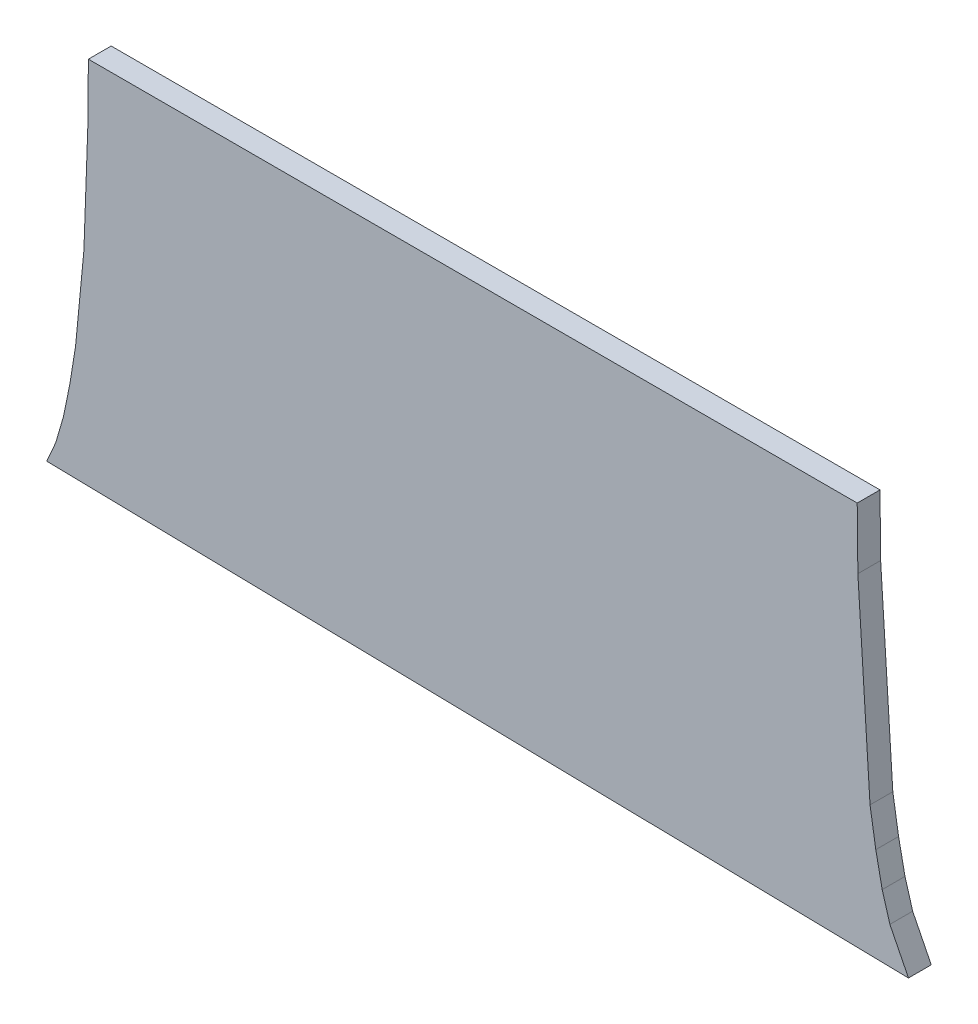
ISO-10303-21;
HEADER;
FILE_DESCRIPTION(('STEP AP214'),'2;1');
FILE_NAME('part.step','',(''),(''),'','','');
FILE_SCHEMA(('AUTOMOTIVE_DESIGN { 1 0 10303 214 1 1 1 1 }'));
ENDSEC;
DATA;
#1=APPLICATION_CONTEXT('core data for automotive mechanical design processes');
#2=APPLICATION_PROTOCOL_DEFINITION('international standard','automotive_design',2000,#1);
#3=PRODUCT_CONTEXT('',#1,'mechanical');
#4=PRODUCT('Part','Part','',(#3));
#5=PRODUCT_RELATED_PRODUCT_CATEGORY('part','',(#4));
#6=PRODUCT_DEFINITION_FORMATION('','',#4);
#7=PRODUCT_DEFINITION_CONTEXT('part definition',#1,'design');
#8=PRODUCT_DEFINITION('design','',#6,#7);
#9=PRODUCT_DEFINITION_SHAPE('','',#8);
#10=(LENGTH_UNIT() NAMED_UNIT(*) SI_UNIT(.MILLI.,.METRE.));
#11=(NAMED_UNIT(*) PLANE_ANGLE_UNIT() SI_UNIT($,.RADIAN.));
#12=(NAMED_UNIT(*) SI_UNIT($,.STERADIAN.) SOLID_ANGLE_UNIT());
#13=UNCERTAINTY_MEASURE_WITH_UNIT(LENGTH_MEASURE(1.E-05),#10,'distance_accuracy_value','');
#14=(GEOMETRIC_REPRESENTATION_CONTEXT(3) GLOBAL_UNCERTAINTY_ASSIGNED_CONTEXT((#13)) GLOBAL_UNIT_ASSIGNED_CONTEXT((#10,
#11,#12)) REPRESENTATION_CONTEXT('',''));
#15=CARTESIAN_POINT('',(0.,0.,0.));
#16=DIRECTION('',(0.,0.,1.));
#17=DIRECTION('',(1.,0.,0.));
#18=AXIS2_PLACEMENT_3D('',#15,#16,#17);
#19=CARTESIAN_POINT('',(54.2799987792969,76.4120025634766,0.));
#20=DIRECTION('',(0.999944665202742,-0.010519816185477,0.));
#21=DIRECTION('',(-0.010519816185477,-0.999944665202742,0.));
#22=AXIS2_PLACEMENT_3D('',#19,#20,#21);
#23=PLANE('',#22);
#24=DIRECTION('',(-0.010519816185477,-0.999944665202742,0.));
#25=VECTOR('',#24,1.);
#26=CARTESIAN_POINT('',(54.2799987792969,76.4120025634766,0.03556));
#27=LINE('',#26,#25);
#28=CARTESIAN_POINT('',(54.2799987792969,76.4120025634766,0.03556));
#29=VERTEX_POINT('',#28);
#30=CARTESIAN_POINT('',(54.2789993286133,76.3170013427734,0.03556));
#31=VERTEX_POINT('',#30);
#32=EDGE_CURVE('E11',#29,#31,#27,.T.);
#33=ORIENTED_EDGE('',*,*,#32,.F.);
#34=DIRECTION('',(0.,0.,1.));
#35=VECTOR('',#34,1.);
#36=CARTESIAN_POINT('',(54.2799987792969,76.4120025634766,0.));
#37=LINE('',#36,#35);
#38=CARTESIAN_POINT('',(54.2799987792969,76.4120025634766,0.));
#39=VERTEX_POINT('',#38);
#40=EDGE_CURVE('E24',#39,#29,#37,.T.);
#41=ORIENTED_EDGE('',*,*,#40,.F.);
#42=DIRECTION('',(-0.010519816185477,-0.999944665202742,0.));
#43=VECTOR('',#42,1.);
#44=CARTESIAN_POINT('',(54.2799987792969,76.4120025634766,0.));
#45=LINE('',#44,#43);
#46=CARTESIAN_POINT('',(54.2789993286133,76.3170013427734,0.));
#47=VERTEX_POINT('',#46);
#48=EDGE_CURVE('E142',#39,#47,#45,.T.);
#49=ORIENTED_EDGE('',*,*,#48,.T.);
#50=DIRECTION('',(0.,0.,1.));
#51=VECTOR('',#50,1.);
#52=CARTESIAN_POINT('',(54.2789993286133,76.3170013427734,0.));
#53=LINE('',#52,#51);
#54=EDGE_CURVE('E37',#47,#31,#53,.T.);
#55=ORIENTED_EDGE('',*,*,#54,.T.);
#56=EDGE_LOOP('',(#33,#41,#49,#55));
#57=FACE_BOUND('',#56,.T.);
#58=ADVANCED_FACE('F17',(#57),#23,.F.);
#59=CARTESIAN_POINT('',(54.2789993286133,76.3170013427734,0.));
#60=DIRECTION('',(0.999355095600041,-0.0359081174420683,0.));
#61=DIRECTION('',(-0.0359081174420683,-0.999355095600041,0.));
#62=AXIS2_PLACEMENT_3D('',#59,#60,#61);
#63=PLANE('',#62);
#64=DIRECTION('',(-0.0359081174420683,-0.999355095600041,0.));
#65=VECTOR('',#64,1.);
#66=CARTESIAN_POINT('',(54.2789993286133,76.3170013427734,0.03556));
#67=LINE('',#66,#65);
#68=CARTESIAN_POINT('',(54.2729988098144,76.1500015258789,0.03556));
#69=VERTEX_POINT('',#68);
#70=EDGE_CURVE('E238',#31,#69,#67,.T.);
#71=ORIENTED_EDGE('',*,*,#70,.F.);
#72=ORIENTED_EDGE('',*,*,#54,.F.);
#73=DIRECTION('',(-0.0359081174420683,-0.999355095600041,0.));
#74=VECTOR('',#73,1.);
#75=CARTESIAN_POINT('',(54.2789993286133,76.3170013427734,0.));
#76=LINE('',#75,#74);
#77=CARTESIAN_POINT('',(54.2729988098144,76.1500015258789,0.));
#78=VERTEX_POINT('',#77);
#79=EDGE_CURVE('E235',#47,#78,#76,.T.);
#80=ORIENTED_EDGE('',*,*,#79,.T.);
#81=DIRECTION('',(0.,0.,1.));
#82=VECTOR('',#81,1.);
#83=CARTESIAN_POINT('',(54.2729988098144,76.1500015258789,0.));
#84=LINE('',#83,#82);
#85=EDGE_CURVE('E233',#78,#69,#84,.T.);
#86=ORIENTED_EDGE('',*,*,#85,.T.);
#87=EDGE_LOOP('',(#71,#72,#80,#86));
#88=FACE_BOUND('',#87,.T.);
#89=ADVANCED_FACE('F246',(#88),#63,.F.);
#90=CARTESIAN_POINT('',(54.2729988098144,76.1500015258789,0.));
#91=DIRECTION('',(0.99546228232144,-0.0951569465430121,0.));
#92=DIRECTION('',(-0.0951569465430121,-0.99546228232144,0.));
#93=AXIS2_PLACEMENT_3D('',#90,#91,#92);
#94=PLANE('',#93);
#95=DIRECTION('',(-0.0951569465430121,-0.99546228232144,0.));
#96=VECTOR('',#95,1.);
#97=CARTESIAN_POINT('',(54.2729988098144,76.1500015258789,0.03556));
#98=LINE('',#97,#96);
#99=CARTESIAN_POINT('',(54.2599983215332,76.0139999389648,0.03556));
#100=VERTEX_POINT('',#99);
#101=EDGE_CURVE('E230',#69,#100,#98,.T.);
#102=ORIENTED_EDGE('',*,*,#101,.F.);
#103=ORIENTED_EDGE('',*,*,#85,.F.);
#104=DIRECTION('',(-0.0951569465430121,-0.99546228232144,0.));
#105=VECTOR('',#104,1.);
#106=CARTESIAN_POINT('',(54.2729988098144,76.1500015258789,0.));
#107=LINE('',#106,#105);
#108=CARTESIAN_POINT('',(54.2599983215332,76.0139999389648,0.));
#109=VERTEX_POINT('',#108);
#110=EDGE_CURVE('E227',#78,#109,#107,.T.);
#111=ORIENTED_EDGE('',*,*,#110,.T.);
#112=DIRECTION('',(0.,0.,1.));
#113=VECTOR('',#112,1.);
#114=CARTESIAN_POINT('',(54.2599983215332,76.0139999389648,0.));
#115=LINE('',#114,#113);
#116=EDGE_CURVE('E225',#109,#100,#115,.T.);
#117=ORIENTED_EDGE('',*,*,#116,.T.);
#118=EDGE_LOOP('',(#102,#103,#111,#117));
#119=FACE_BOUND('',#118,.T.);
#120=ADVANCED_FACE('F252',(#119),#94,.F.);
#121=CARTESIAN_POINT('',(54.2599983215332,76.0139999389648,0.));
#122=DIRECTION('',(0.98733338167223,-0.158659362899509,0.));
#123=DIRECTION('',(-0.158659362899509,-0.98733338167223,0.));
#124=AXIS2_PLACEMENT_3D('',#121,#122,#123);
#125=PLANE('',#124);
#126=DIRECTION('',(-0.158659362899509,-0.98733338167223,0.));
#127=VECTOR('',#126,1.);
#128=CARTESIAN_POINT('',(54.2599983215332,76.0139999389648,0.03556));
#129=LINE('',#128,#127);
#130=CARTESIAN_POINT('',(54.2509994506836,75.9580001831055,0.03556));
#131=VERTEX_POINT('',#130);
#132=EDGE_CURVE('E222',#100,#131,#129,.T.);
#133=ORIENTED_EDGE('',*,*,#132,.F.);
#134=ORIENTED_EDGE('',*,*,#116,.F.);
#135=DIRECTION('',(-0.158659362899509,-0.98733338167223,0.));
#136=VECTOR('',#135,1.);
#137=CARTESIAN_POINT('',(54.2599983215332,76.0139999389648,0.));
#138=LINE('',#137,#136);
#139=CARTESIAN_POINT('',(54.2509994506836,75.9580001831055,0.));
#140=VERTEX_POINT('',#139);
#141=EDGE_CURVE('E219',#109,#140,#138,.T.);
#142=ORIENTED_EDGE('',*,*,#141,.T.);
#143=DIRECTION('',(0.,0.,1.));
#144=VECTOR('',#143,1.);
#145=CARTESIAN_POINT('',(54.2509994506836,75.9580001831055,0.));
#146=LINE('',#145,#144);
#147=EDGE_CURVE('E217',#140,#131,#146,.T.);
#148=ORIENTED_EDGE('',*,*,#147,.T.);
#149=EDGE_LOOP('',(#133,#134,#142,#148));
#150=FACE_BOUND('',#149,.T.);
#151=ADVANCED_FACE('F254',(#150),#125,.F.);
#152=CARTESIAN_POINT('',(54.2509994506836,75.9580001831055,0.));
#153=DIRECTION('',(0.979813511857472,-0.199913686328696,0.));
#154=DIRECTION('',(-0.199913686328696,-0.979813511857472,0.));
#155=AXIS2_PLACEMENT_3D('',#152,#153,#154);
#156=PLANE('',#155);
#157=DIRECTION('',(-0.199913686328696,-0.979813511857472,0.));
#158=VECTOR('',#157,1.);
#159=CARTESIAN_POINT('',(54.2509994506836,75.9580001831055,0.03556));
#160=LINE('',#159,#158);
#161=CARTESIAN_POINT('',(54.2410011291504,75.9089965820313,0.03556));
#162=VERTEX_POINT('',#161);
#163=EDGE_CURVE('E214',#131,#162,#160,.T.);
#164=ORIENTED_EDGE('',*,*,#163,.F.);
#165=ORIENTED_EDGE('',*,*,#147,.F.);
#166=DIRECTION('',(-0.199913686328696,-0.979813511857472,0.));
#167=VECTOR('',#166,1.);
#168=CARTESIAN_POINT('',(54.2509994506836,75.9580001831055,0.));
#169=LINE('',#168,#167);
#170=CARTESIAN_POINT('',(54.2410011291504,75.9089965820313,0.));
#171=VERTEX_POINT('',#170);
#172=EDGE_CURVE('E211',#140,#171,#169,.T.);
#173=ORIENTED_EDGE('',*,*,#172,.T.);
#174=DIRECTION('',(0.,0.,1.));
#175=VECTOR('',#174,1.);
#176=CARTESIAN_POINT('',(54.2410011291504,75.9089965820313,0.));
#177=LINE('',#176,#175);
#178=EDGE_CURVE('E209',#171,#162,#177,.T.);
#179=ORIENTED_EDGE('',*,*,#178,.T.);
#180=EDGE_LOOP('',(#164,#165,#173,#179));
#181=FACE_BOUND('',#180,.T.);
#182=ADVANCED_FACE('F259',(#181),#156,.F.);
#183=CARTESIAN_POINT('',(54.2410011291504,75.9089965820313,0.));
#184=DIRECTION('',(0.959731535414619,-0.280918813771343,0.));
#185=DIRECTION('',(-0.280918813771343,-0.959731535414619,0.));
#186=AXIS2_PLACEMENT_3D('',#183,#184,#185);
#187=PLANE('',#186);
#188=DIRECTION('',(-0.280918813771343,-0.959731535414619,0.));
#189=VECTOR('',#188,1.);
#190=CARTESIAN_POINT('',(54.2410011291504,75.9089965820313,0.03556));
#191=LINE('',#190,#189);
#192=CARTESIAN_POINT('',(54.2290000915527,75.8679962158203,0.03556));
#193=VERTEX_POINT('',#192);
#194=EDGE_CURVE('E206',#162,#193,#191,.T.);
#195=ORIENTED_EDGE('',*,*,#194,.F.);
#196=ORIENTED_EDGE('',*,*,#178,.F.);
#197=DIRECTION('',(-0.280918813771343,-0.959731535414619,0.));
#198=VECTOR('',#197,1.);
#199=CARTESIAN_POINT('',(54.2410011291504,75.9089965820313,0.));
#200=LINE('',#199,#198);
#201=CARTESIAN_POINT('',(54.2290000915527,75.8679962158203,0.));
#202=VERTEX_POINT('',#201);
#203=EDGE_CURVE('E203',#171,#202,#200,.T.);
#204=ORIENTED_EDGE('',*,*,#203,.T.);
#205=DIRECTION('',(0.,0.,1.));
#206=VECTOR('',#205,1.);
#207=CARTESIAN_POINT('',(54.2290000915527,75.8679962158203,0.));
#208=LINE('',#207,#206);
#209=EDGE_CURVE('E201',#202,#193,#208,.T.);
#210=ORIENTED_EDGE('',*,*,#209,.T.);
#211=EDGE_LOOP('',(#195,#196,#204,#210));
#212=FACE_BOUND('',#211,.T.);
#213=ADVANCED_FACE('F262',(#212),#187,.F.);
#214=CARTESIAN_POINT('',(54.2290000915527,75.8679962158203,0.));
#215=DIRECTION('',(0.916147307752552,-0.400841752438229,0.));
#216=DIRECTION('',(-0.400841752438229,-0.916147307752552,0.));
#217=AXIS2_PLACEMENT_3D('',#214,#215,#216);
#218=PLANE('',#217);
#219=DIRECTION('',(-0.400841752438229,-0.916147307752552,0.));
#220=VECTOR('',#219,1.);
#221=CARTESIAN_POINT('',(54.2290000915527,75.8679962158203,0.03556));
#222=LINE('',#221,#220);
#223=CARTESIAN_POINT('',(54.2150001525879,75.8359985351562,0.03556));
#224=VERTEX_POINT('',#223);
#225=EDGE_CURVE('E198',#193,#224,#222,.T.);
#226=ORIENTED_EDGE('',*,*,#225,.F.);
#227=ORIENTED_EDGE('',*,*,#209,.F.);
#228=DIRECTION('',(-0.400841752438229,-0.916147307752552,0.));
#229=VECTOR('',#228,1.);
#230=CARTESIAN_POINT('',(54.2290000915527,75.8679962158203,0.));
#231=LINE('',#230,#229);
#232=CARTESIAN_POINT('',(54.2150001525879,75.8359985351562,0.));
#233=VERTEX_POINT('',#232);
#234=EDGE_CURVE('E195',#202,#233,#231,.T.);
#235=ORIENTED_EDGE('',*,*,#234,.T.);
#236=DIRECTION('',(0.,0.,1.));
#237=VECTOR('',#236,1.);
#238=CARTESIAN_POINT('',(54.2150001525879,75.8359985351562,0.));
#239=LINE('',#238,#237);
#240=EDGE_CURVE('E193',#233,#224,#239,.T.);
#241=ORIENTED_EDGE('',*,*,#240,.T.);
#242=EDGE_LOOP('',(#226,#227,#235,#241));
#243=FACE_BOUND('',#242,.T.);
#244=ADVANCED_FACE('F267',(#243),#218,.F.);
#245=CARTESIAN_POINT('',(54.2150001525879,75.8359985351562,0.));
#246=DIRECTION('',(0.0193279523614092,0.999813197681205,0.));
#247=DIRECTION('',(0.999813197681205,-0.0193279523614092,0.));
#248=AXIS2_PLACEMENT_3D('',#245,#246,#247);
#249=PLANE('',#248);
#250=DIRECTION('',(0.999813197681205,-0.0193279523614092,0.));
#251=VECTOR('',#250,1.);
#252=CARTESIAN_POINT('',(54.2150001525879,75.8359985351562,0.03556));
#253=LINE('',#252,#251);
#254=CARTESIAN_POINT('',(55.560001373291,75.8099975585938,0.03556));
#255=VERTEX_POINT('',#254);
#256=EDGE_CURVE('E190',#224,#255,#253,.T.);
#257=ORIENTED_EDGE('',*,*,#256,.F.);
#258=ORIENTED_EDGE('',*,*,#240,.F.);
#259=DIRECTION('',(0.999813197681205,-0.0193279523614092,0.));
#260=VECTOR('',#259,1.);
#261=CARTESIAN_POINT('',(54.2150001525879,75.8359985351562,0.));
#262=LINE('',#261,#260);
#263=CARTESIAN_POINT('',(55.560001373291,75.8099975585938,0.));
#264=VERTEX_POINT('',#263);
#265=EDGE_CURVE('E187',#233,#264,#262,.T.);
#266=ORIENTED_EDGE('',*,*,#265,.T.);
#267=DIRECTION('',(0.,0.,1.));
#268=VECTOR('',#267,1.);
#269=CARTESIAN_POINT('',(55.560001373291,75.8099975585938,0.));
#270=LINE('',#269,#268);
#271=EDGE_CURVE('E185',#264,#255,#270,.T.);
#272=ORIENTED_EDGE('',*,*,#271,.T.);
#273=EDGE_LOOP('',(#257,#258,#266,#272));
#274=FACE_BOUND('',#273,.T.);
#275=ADVANCED_FACE('F270',(#274),#249,.F.);
#276=CARTESIAN_POINT('',(55.560001373291,75.8099975585938,0.));
#277=DIRECTION('',(-0.89440365901572,-0.447260656373094,0.));
#278=DIRECTION('',(-0.447260656373094,0.89440365901572,0.));
#279=AXIS2_PLACEMENT_3D('',#276,#277,#278);
#280=PLANE('',#279);
#281=DIRECTION('',(-0.447260656373094,0.89440365901572,0.));
#282=VECTOR('',#281,1.);
#283=CARTESIAN_POINT('',(55.560001373291,75.8099975585938,0.03556));
#284=LINE('',#283,#282);
#285=CARTESIAN_POINT('',(55.5309982299805,75.8679962158203,0.03556));
#286=VERTEX_POINT('',#285);
#287=EDGE_CURVE('E182',#255,#286,#284,.T.);
#288=ORIENTED_EDGE('',*,*,#287,.F.);
#289=ORIENTED_EDGE('',*,*,#271,.F.);
#290=DIRECTION('',(-0.447260656373094,0.89440365901572,0.));
#291=VECTOR('',#290,1.);
#292=CARTESIAN_POINT('',(55.560001373291,75.8099975585938,0.));
#293=LINE('',#292,#291);
#294=CARTESIAN_POINT('',(55.5309982299805,75.8679962158203,0.));
#295=VERTEX_POINT('',#294);
#296=EDGE_CURVE('E179',#264,#295,#293,.T.);
#297=ORIENTED_EDGE('',*,*,#296,.T.);
#298=DIRECTION('',(0.,0.,1.));
#299=VECTOR('',#298,1.);
#300=CARTESIAN_POINT('',(55.5309982299805,75.8679962158203,0.));
#301=LINE('',#300,#299);
#302=EDGE_CURVE('E177',#295,#286,#301,.T.);
#303=ORIENTED_EDGE('',*,*,#302,.T.);
#304=EDGE_LOOP('',(#288,#289,#297,#303));
#305=FACE_BOUND('',#304,.T.);
#306=ADVANCED_FACE('F275',(#305),#280,.F.);
#307=CARTESIAN_POINT('',(55.5309982299805,75.8679962158203,0.));
#308=DIRECTION('',(-0.959755606740296,-0.280836563379069,0.));
#309=DIRECTION('',(-0.280836563379069,0.959755606740296,0.));
#310=AXIS2_PLACEMENT_3D('',#307,#308,#309);
#311=PLANE('',#310);
#312=DIRECTION('',(-0.280836563379069,0.959755606740296,0.));
#313=VECTOR('',#312,1.);
#314=CARTESIAN_POINT('',(55.5309982299805,75.8679962158203,0.03556));
#315=LINE('',#314,#313);
#316=CARTESIAN_POINT('',(55.5190010070801,75.9089965820313,0.03556));
#317=VERTEX_POINT('',#316);
#318=EDGE_CURVE('E174',#286,#317,#315,.T.);
#319=ORIENTED_EDGE('',*,*,#318,.F.);
#320=ORIENTED_EDGE('',*,*,#302,.F.);
#321=DIRECTION('',(-0.280836563379069,0.959755606740296,0.));
#322=VECTOR('',#321,1.);
#323=CARTESIAN_POINT('',(55.5309982299805,75.8679962158203,0.));
#324=LINE('',#323,#322);
#325=CARTESIAN_POINT('',(55.5190010070801,75.9089965820313,0.));
#326=VERTEX_POINT('',#325);
#327=EDGE_CURVE('E171',#295,#326,#324,.T.);
#328=ORIENTED_EDGE('',*,*,#327,.T.);
#329=DIRECTION('',(0.,0.,1.));
#330=VECTOR('',#329,1.);
#331=CARTESIAN_POINT('',(55.5190010070801,75.9089965820313,0.));
#332=LINE('',#331,#330);
#333=EDGE_CURVE('E169',#326,#317,#332,.T.);
#334=ORIENTED_EDGE('',*,*,#333,.T.);
#335=EDGE_LOOP('',(#319,#320,#328,#334));
#336=FACE_BOUND('',#335,.T.);
#337=ADVANCED_FACE('F278',(#336),#311,.F.);
#338=CARTESIAN_POINT('',(55.5190010070801,75.9089965820313,0.));
#339=DIRECTION('',(-0.979798568975567,-0.199986910155218,0.));
#340=DIRECTION('',(-0.199986910155218,0.979798568975567,0.));
#341=AXIS2_PLACEMENT_3D('',#338,#339,#340);
#342=PLANE('',#341);
#343=DIRECTION('',(-0.199986910155218,0.979798568975567,0.));
#344=VECTOR('',#343,1.);
#345=CARTESIAN_POINT('',(55.5190010070801,75.9089965820313,0.03556));
#346=LINE('',#345,#344);
#347=CARTESIAN_POINT('',(55.5089988708496,75.9580001831055,0.03556));
#348=VERTEX_POINT('',#347);
#349=EDGE_CURVE('E166',#317,#348,#346,.T.);
#350=ORIENTED_EDGE('',*,*,#349,.F.);
#351=ORIENTED_EDGE('',*,*,#333,.F.);
#352=DIRECTION('',(-0.199986910155218,0.979798568975567,0.));
#353=VECTOR('',#352,1.);
#354=CARTESIAN_POINT('',(55.5190010070801,75.9089965820313,0.));
#355=LINE('',#354,#353);
#356=CARTESIAN_POINT('',(55.5089988708496,75.9580001831055,0.));
#357=VERTEX_POINT('',#356);
#358=EDGE_CURVE('E163',#326,#357,#355,.T.);
#359=ORIENTED_EDGE('',*,*,#358,.T.);
#360=DIRECTION('',(0.,0.,1.));
#361=VECTOR('',#360,1.);
#362=CARTESIAN_POINT('',(55.5089988708496,75.9580001831055,0.));
#363=LINE('',#362,#361);
#364=EDGE_CURVE('E161',#357,#348,#363,.T.);
#365=ORIENTED_EDGE('',*,*,#364,.T.);
#366=EDGE_LOOP('',(#350,#351,#359,#365));
#367=FACE_BOUND('',#366,.T.);
#368=ADVANCED_FACE('F283',(#367),#342,.F.);
#369=CARTESIAN_POINT('',(55.5089988708496,75.9580001831055,0.));
#370=DIRECTION('',(-0.98733338167223,-0.158659362899509,0.));
#371=DIRECTION('',(-0.158659362899509,0.98733338167223,0.));
#372=AXIS2_PLACEMENT_3D('',#369,#370,#371);
#373=PLANE('',#372);
#374=DIRECTION('',(-0.158659362899509,0.98733338167223,0.));
#375=VECTOR('',#374,1.);
#376=CARTESIAN_POINT('',(55.5089988708496,75.9580001831055,0.03556));
#377=LINE('',#376,#375);
#378=CARTESIAN_POINT('',(55.5,76.0139999389648,0.03556));
#379=VERTEX_POINT('',#378);
#380=EDGE_CURVE('E158',#348,#379,#377,.T.);
#381=ORIENTED_EDGE('',*,*,#380,.F.);
#382=ORIENTED_EDGE('',*,*,#364,.F.);
#383=DIRECTION('',(-0.158659362899509,0.98733338167223,0.));
#384=VECTOR('',#383,1.);
#385=CARTESIAN_POINT('',(55.5089988708496,75.9580001831055,0.));
#386=LINE('',#385,#384);
#387=CARTESIAN_POINT('',(55.5,76.0139999389648,0.));
#388=VERTEX_POINT('',#387);
#389=EDGE_CURVE('E155',#357,#388,#386,.T.);
#390=ORIENTED_EDGE('',*,*,#389,.T.);
#391=DIRECTION('',(0.,0.,1.));
#392=VECTOR('',#391,1.);
#393=CARTESIAN_POINT('',(55.5,76.0139999389648,0.));
#394=LINE('',#393,#392);
#395=EDGE_CURVE('E153',#388,#379,#394,.T.);
#396=ORIENTED_EDGE('',*,*,#395,.T.);
#397=EDGE_LOOP('',(#381,#382,#390,#396));
#398=FACE_BOUND('',#397,.T.);
#399=ADVANCED_FACE('F286',(#398),#373,.F.);
#400=CARTESIAN_POINT('',(55.5,76.0139999389648,0.));
#401=DIRECTION('',(-0.998039551751542,-0.0625863654447241,0.));
#402=DIRECTION('',(-0.0625863654447241,0.998039551751542,0.));
#403=AXIS2_PLACEMENT_3D('',#400,#401,#402);
#404=PLANE('',#403);
#405=DIRECTION('',(-0.062586365444724,0.998039551751542,0.));
#406=VECTOR('',#405,1.);
#407=CARTESIAN_POINT('',(55.5,76.0139999389648,0.03556));
#408=LINE('',#407,#406);
#409=CARTESIAN_POINT('',(55.4809989929199,76.3170013427734,0.03556));
#410=VERTEX_POINT('',#409);
#411=EDGE_CURVE('E150',#379,#410,#408,.T.);
#412=ORIENTED_EDGE('',*,*,#411,.F.);
#413=ORIENTED_EDGE('',*,*,#395,.F.);
#414=DIRECTION('',(-0.062586365444724,0.998039551751542,0.));
#415=VECTOR('',#414,1.);
#416=CARTESIAN_POINT('',(55.5,76.0139999389648,0.));
#417=LINE('',#416,#415);
#418=CARTESIAN_POINT('',(55.4809989929199,76.3170013427734,0.));
#419=VERTEX_POINT('',#418);
#420=EDGE_CURVE('E148',#388,#419,#417,.T.);
#421=ORIENTED_EDGE('',*,*,#420,.T.);
#422=DIRECTION('',(0.,0.,1.));
#423=VECTOR('',#422,1.);
#424=CARTESIAN_POINT('',(55.4809989929199,76.3170013427734,0.));
#425=LINE('',#424,#423);
#426=EDGE_CURVE('E133',#419,#410,#425,.T.);
#427=ORIENTED_EDGE('',*,*,#426,.T.);
#428=EDGE_LOOP('',(#412,#413,#421,#427));
#429=FACE_BOUND('',#428,.T.);
#430=ADVANCED_FACE('F289',(#429),#404,.F.);
#431=CARTESIAN_POINT('',(55.4809989929199,76.3170013427734,0.));
#432=DIRECTION('',(-0.999944665202742,-0.010519816185477,0.));
#433=DIRECTION('',(-0.010519816185477,0.999944665202742,0.));
#434=AXIS2_PLACEMENT_3D('',#431,#432,#433);
#435=PLANE('',#434);
#436=DIRECTION('',(-0.010519816185477,0.999944665202742,0.));
#437=VECTOR('',#436,1.);
#438=CARTESIAN_POINT('',(55.4809989929199,76.3170013427734,0.03556));
#439=LINE('',#438,#437);
#440=CARTESIAN_POINT('',(55.4799995422363,76.4120025634766,0.03556));
#441=VERTEX_POINT('',#440);
#442=EDGE_CURVE('E137',#410,#441,#439,.T.);
#443=ORIENTED_EDGE('',*,*,#442,.F.);
#444=ORIENTED_EDGE('',*,*,#426,.F.);
#445=DIRECTION('',(-0.010519816185477,0.999944665202742,0.));
#446=VECTOR('',#445,1.);
#447=CARTESIAN_POINT('',(55.4809989929199,76.3170013427734,0.));
#448=LINE('',#447,#446);
#449=CARTESIAN_POINT('',(55.4799995422363,76.4120025634766,0.));
#450=VERTEX_POINT('',#449);
#451=EDGE_CURVE('E129',#419,#450,#448,.T.);
#452=ORIENTED_EDGE('',*,*,#451,.T.);
#453=DIRECTION('',(0.,0.,1.));
#454=VECTOR('',#453,1.);
#455=CARTESIAN_POINT('',(55.4799995422363,76.4120025634766,0.));
#456=LINE('',#455,#454);
#457=EDGE_CURVE('E119',#450,#441,#456,.T.);
#458=ORIENTED_EDGE('',*,*,#457,.T.);
#459=EDGE_LOOP('',(#443,#444,#452,#458));
#460=FACE_BOUND('',#459,.T.);
#461=ADVANCED_FACE('F132',(#460),#435,.F.);
#462=CARTESIAN_POINT('',(55.4799995422363,76.4120025634766,0.));
#463=DIRECTION('',(0.,-1.,0.));
#464=DIRECTION('',(-1.,0.,0.));
#465=AXIS2_PLACEMENT_3D('',#462,#463,#464);
#466=PLANE('',#465);
#467=DIRECTION('',(-1.,0.,0.));
#468=VECTOR('',#467,1.);
#469=CARTESIAN_POINT('',(55.4799995422363,76.4120025634766,0.03556));
#470=LINE('',#469,#468);
#471=EDGE_CURVE('E125',#441,#29,#470,.T.);
#472=ORIENTED_EDGE('',*,*,#471,.F.);
#473=ORIENTED_EDGE('',*,*,#457,.F.);
#474=DIRECTION('',(-1.,0.,0.));
#475=VECTOR('',#474,1.);
#476=CARTESIAN_POINT('',(55.4799995422363,76.4120025634766,0.));
#477=LINE('',#476,#475);
#478=EDGE_CURVE('E123',#450,#39,#477,.T.);
#479=ORIENTED_EDGE('',*,*,#478,.T.);
#480=ORIENTED_EDGE('',*,*,#40,.T.);
#481=EDGE_LOOP('',(#472,#473,#479,#480));
#482=FACE_BOUND('',#481,.T.);
#483=ADVANCED_FACE('F121',(#482),#466,.F.);
#484=CARTESIAN_POINT('',(54.2799987792969,76.4120025634766,0.));
#485=DIRECTION('',(0.,0.,1.));
#486=DIRECTION('',(1.,0.,0.));
#487=AXIS2_PLACEMENT_3D('',#484,#485,#486);
#488=PLANE('',#487);
#489=ORIENTED_EDGE('',*,*,#478,.F.);
#490=ORIENTED_EDGE('',*,*,#451,.F.);
#491=ORIENTED_EDGE('',*,*,#420,.F.);
#492=ORIENTED_EDGE('',*,*,#389,.F.);
#493=ORIENTED_EDGE('',*,*,#358,.F.);
#494=ORIENTED_EDGE('',*,*,#327,.F.);
#495=ORIENTED_EDGE('',*,*,#296,.F.);
#496=ORIENTED_EDGE('',*,*,#265,.F.);
#497=ORIENTED_EDGE('',*,*,#234,.F.);
#498=ORIENTED_EDGE('',*,*,#203,.F.);
#499=ORIENTED_EDGE('',*,*,#172,.F.);
#500=ORIENTED_EDGE('',*,*,#141,.F.);
#501=ORIENTED_EDGE('',*,*,#110,.F.);
#502=ORIENTED_EDGE('',*,*,#79,.F.);
#503=ORIENTED_EDGE('',*,*,#48,.F.);
#504=EDGE_LOOP('',(#489,#490,#491,#492,#493,#494,#495,#496,#497,#498,#499,#500,#501,#502,#503));
#505=FACE_BOUND('',#504,.T.);
#506=ADVANCED_FACE('F140',(#505),#488,.F.);
#507=CARTESIAN_POINT('',(54.2799987792969,76.4120025634766,0.03556));
#508=DIRECTION('',(0.,0.,1.));
#509=DIRECTION('',(1.,0.,0.));
#510=AXIS2_PLACEMENT_3D('',#507,#508,#509);
#511=PLANE('',#510);
#512=ORIENTED_EDGE('',*,*,#32,.T.);
#513=ORIENTED_EDGE('',*,*,#70,.T.);
#514=ORIENTED_EDGE('',*,*,#101,.T.);
#515=ORIENTED_EDGE('',*,*,#132,.T.);
#516=ORIENTED_EDGE('',*,*,#163,.T.);
#517=ORIENTED_EDGE('',*,*,#194,.T.);
#518=ORIENTED_EDGE('',*,*,#225,.T.);
#519=ORIENTED_EDGE('',*,*,#256,.T.);
#520=ORIENTED_EDGE('',*,*,#287,.T.);
#521=ORIENTED_EDGE('',*,*,#318,.T.);
#522=ORIENTED_EDGE('',*,*,#349,.T.);
#523=ORIENTED_EDGE('',*,*,#380,.T.);
#524=ORIENTED_EDGE('',*,*,#411,.T.);
#525=ORIENTED_EDGE('',*,*,#442,.T.);
#526=ORIENTED_EDGE('',*,*,#471,.T.);
#527=EDGE_LOOP('',(#512,#513,#514,#515,#516,#517,#518,#519,#520,#521,#522,#523,#524,#525,#526));
#528=FACE_BOUND('',#527,.T.);
#529=ADVANCED_FACE('F249',(#528),#511,.T.);
#530=CLOSED_SHELL('',(#58,#89,#120,#151,#182,#213,#244,#275,#306,#337,#368,#399,#430,#461,#483,
#506,#529));
#531=MANIFOLD_SOLID_BREP('B1',#530);
#532=ADVANCED_BREP_SHAPE_REPRESENTATION('',(#18,#531),#14);
#533=SHAPE_DEFINITION_REPRESENTATION(#9,#532);
ENDSEC;
END-ISO-10303-21;
